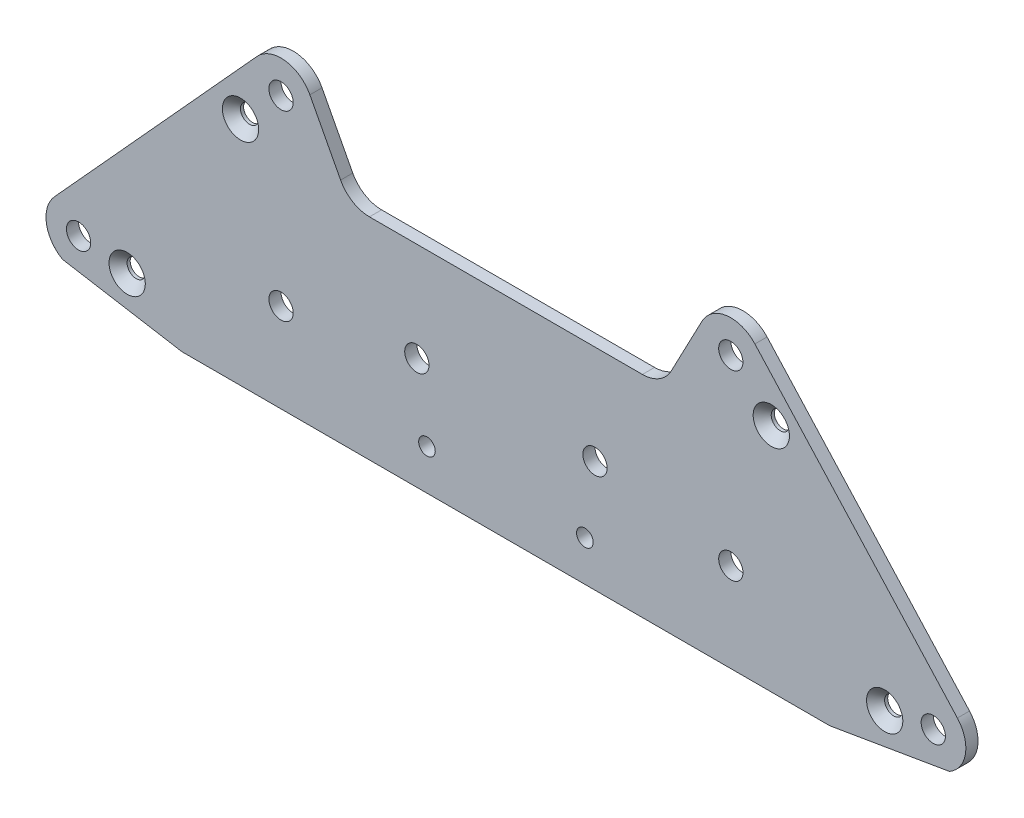
ISO-10303-21;
HEADER;
FILE_DESCRIPTION(('STEP AP214'),'2;1');
FILE_NAME('part.step','',(''),(''),'','','');
FILE_SCHEMA(('AUTOMOTIVE_DESIGN { 1 0 10303 214 1 1 1 1 }'));
ENDSEC;
DATA;
#1=APPLICATION_CONTEXT('core data for automotive mechanical design processes');
#2=APPLICATION_PROTOCOL_DEFINITION('international standard','automotive_design',2000,#1);
#3=PRODUCT_CONTEXT('',#1,'mechanical');
#4=PRODUCT('Part','Part','',(#3));
#5=PRODUCT_RELATED_PRODUCT_CATEGORY('part','',(#4));
#6=PRODUCT_DEFINITION_FORMATION('','',#4);
#7=PRODUCT_DEFINITION_CONTEXT('part definition',#1,'design');
#8=PRODUCT_DEFINITION('design','',#6,#7);
#9=PRODUCT_DEFINITION_SHAPE('','',#8);
#10=(LENGTH_UNIT() NAMED_UNIT(*) SI_UNIT(.MILLI.,.METRE.));
#11=(NAMED_UNIT(*) PLANE_ANGLE_UNIT() SI_UNIT($,.RADIAN.));
#12=(NAMED_UNIT(*) SI_UNIT($,.STERADIAN.) SOLID_ANGLE_UNIT());
#13=UNCERTAINTY_MEASURE_WITH_UNIT(LENGTH_MEASURE(1.E-05),#10,'distance_accuracy_value','');
#14=(GEOMETRIC_REPRESENTATION_CONTEXT(3) GLOBAL_UNCERTAINTY_ASSIGNED_CONTEXT((#13)) GLOBAL_UNIT_ASSIGNED_CONTEXT((#10,
#11,#12)) REPRESENTATION_CONTEXT('',''));
#15=CARTESIAN_POINT('',(0.,0.,0.));
#16=DIRECTION('',(0.,0.,1.));
#17=DIRECTION('',(1.,0.,0.));
#18=AXIS2_PLACEMENT_3D('',#15,#16,#17);
#19=CARTESIAN_POINT('',(105.536479783985,0.,3.));
#20=DIRECTION('',(0.,0.,-1.));
#21=DIRECTION('',(-1.,0.,0.));
#22=AXIS2_PLACEMENT_3D('',#19,#20,#21);
#23=PLANE('',#22);
#24=CARTESIAN_POINT('',(93.5364797839854,-2.00000000000001,3.));
#25=DIRECTION('',(0.,0.,1.));
#26=DIRECTION('',(1.,0.,0.));
#27=AXIS2_PLACEMENT_3D('',#24,#25,#26);
#28=CIRCLE('',#27,4.48);
#29=CARTESIAN_POINT('',(98.0164797839853,-2.00000000000001,3.));
#30=VERTEX_POINT('',#29);
#31=EDGE_CURVE('E418',#30,#30,#28,.T.);
#32=ORIENTED_EDGE('',*,*,#31,.F.);
#33=EDGE_LOOP('',(#32));
#34=FACE_BOUND('',#33,.T.);
#35=CARTESIAN_POINT('',(65.5364797839853,45.,3.));
#36=DIRECTION('',(0.,0.,1.));
#37=DIRECTION('',(1.,0.,0.));
#38=AXIS2_PLACEMENT_3D('',#35,#36,#37);
#39=CIRCLE('',#38,4.48);
#40=CARTESIAN_POINT('',(70.0164797839853,45.,3.));
#41=VERTEX_POINT('',#40);
#42=EDGE_CURVE('E428',#41,#41,#39,.T.);
#43=ORIENTED_EDGE('',*,*,#42,.F.);
#44=EDGE_LOOP('',(#43));
#45=FACE_BOUND('',#44,.T.);
#46=CARTESIAN_POINT('',(-65.5364797839853,45.,3.));
#47=DIRECTION('',(0.,0.,1.));
#48=DIRECTION('',(1.,0.,0.));
#49=AXIS2_PLACEMENT_3D('',#46,#47,#48);
#50=CIRCLE('',#49,4.48);
#51=CARTESIAN_POINT('',(-61.0564797839853,45.,3.));
#52=VERTEX_POINT('',#51);
#53=EDGE_CURVE('E440',#52,#52,#50,.T.);
#54=ORIENTED_EDGE('',*,*,#53,.F.);
#55=EDGE_LOOP('',(#54));
#56=FACE_BOUND('',#55,.T.);
#57=CARTESIAN_POINT('',(-93.5364797839853,-2.,3.));
#58=DIRECTION('',(0.,0.,1.));
#59=DIRECTION('',(1.,0.,0.));
#60=AXIS2_PLACEMENT_3D('',#57,#58,#59);
#61=CIRCLE('',#60,4.48);
#62=CARTESIAN_POINT('',(-89.0564797839853,-2.,3.));
#63=VERTEX_POINT('',#62);
#64=EDGE_CURVE('E452',#63,#63,#61,.T.);
#65=ORIENTED_EDGE('',*,*,#64,.F.);
#66=EDGE_LOOP('',(#65));
#67=FACE_BOUND('',#66,.T.);
#68=CARTESIAN_POINT('',(19.5,-2.,3.));
#69=DIRECTION('',(0.,0.,1.));
#70=DIRECTION('',(1.,0.,0.));
#71=AXIS2_PLACEMENT_3D('',#68,#69,#70);
#72=CIRCLE('',#71,2.04999999999999);
#73=CARTESIAN_POINT('',(21.55,-2.,3.));
#74=VERTEX_POINT('',#73);
#75=EDGE_CURVE('E464',#74,#74,#72,.T.);
#76=ORIENTED_EDGE('',*,*,#75,.F.);
#77=EDGE_LOOP('',(#76));
#78=FACE_BOUND('',#77,.T.);
#79=CARTESIAN_POINT('',(-19.5,-2.,3.));
#80=DIRECTION('',(0.,0.,1.));
#81=DIRECTION('',(1.,0.,0.));
#82=AXIS2_PLACEMENT_3D('',#79,#80,#81);
#83=CIRCLE('',#82,2.04999999999999);
#84=CARTESIAN_POINT('',(-17.45,-2.,3.));
#85=VERTEX_POINT('',#84);
#86=EDGE_CURVE('E469',#85,#85,#83,.T.);
#87=ORIENTED_EDGE('',*,*,#86,.F.);
#88=EDGE_LOOP('',(#87));
#89=FACE_BOUND('',#88,.T.);
#90=CARTESIAN_POINT('',(-21.9984081380424,15.5854946308941,3.));
#91=DIRECTION('',(0.,0.,1.));
#92=DIRECTION('',(1.,0.,0.));
#93=AXIS2_PLACEMENT_3D('',#90,#91,#92);
#94=CIRCLE('',#93,2.99999999999999);
#95=CARTESIAN_POINT('',(-18.9984081380424,15.5854946308941,3.));
#96=VERTEX_POINT('',#95);
#97=EDGE_CURVE('E489',#96,#96,#94,.T.);
#98=ORIENTED_EDGE('',*,*,#97,.F.);
#99=EDGE_LOOP('',(#98));
#100=FACE_BOUND('',#99,.T.);
#101=CARTESIAN_POINT('',(-55.5364797839854,10.,3.));
#102=DIRECTION('',(0.,0.,1.));
#103=DIRECTION('',(1.,0.,0.));
#104=AXIS2_PLACEMENT_3D('',#101,#102,#103);
#105=CIRCLE('',#104,2.99999999999999);
#106=CARTESIAN_POINT('',(-52.5364797839854,10.,3.));
#107=VERTEX_POINT('',#106);
#108=EDGE_CURVE('E505',#107,#107,#105,.T.);
#109=ORIENTED_EDGE('',*,*,#108,.F.);
#110=EDGE_LOOP('',(#109));
#111=FACE_BOUND('',#110,.T.);
#112=CARTESIAN_POINT('',(55.5364797839853,55.,3.));
#113=DIRECTION('',(0.,0.,1.));
#114=DIRECTION('',(1.,0.,0.));
#115=AXIS2_PLACEMENT_3D('',#112,#113,#114);
#116=CIRCLE('',#115,3.);
#117=CARTESIAN_POINT('',(58.5364797839853,55.,3.));
#118=VERTEX_POINT('',#117);
#119=EDGE_CURVE('E521',#118,#118,#116,.T.);
#120=ORIENTED_EDGE('',*,*,#119,.F.);
#121=EDGE_LOOP('',(#120));
#122=FACE_BOUND('',#121,.T.);
#123=CARTESIAN_POINT('',(105.536479783985,0.,3.));
#124=DIRECTION('',(0.,0.,1.));
#125=DIRECTION('',(1.,0.,0.));
#126=AXIS2_PLACEMENT_3D('',#123,#124,#125);
#127=CIRCLE('',#126,3.00000000000001);
#128=CARTESIAN_POINT('',(108.536479783985,0.,3.));
#129=VERTEX_POINT('',#128);
#130=EDGE_CURVE('E188',#129,#129,#127,.T.);
#131=ORIENTED_EDGE('',*,*,#130,.F.);
#132=EDGE_LOOP('',(#131));
#133=FACE_BOUND('',#132,.T.);
#134=DIRECTION('',(0.985942111915208,0.16708725849741,0.));
#135=VECTOR('',#134,1.);
#136=CARTESIAN_POINT('',(80.,-12.,3.));
#137=LINE('',#136,#135);
#138=CARTESIAN_POINT('',(80.,-12.,3.));
#139=VERTEX_POINT('',#138);
#140=CARTESIAN_POINT('',(109.503808991231,-6.99999999999999,3.));
#141=VERTEX_POINT('',#140);
#142=EDGE_CURVE('E224',#139,#141,#137,.T.);
#143=ORIENTED_EDGE('',*,*,#142,.T.);
#144=CARTESIAN_POINT('',(105.536479783985,0.,3.));
#145=DIRECTION('',(0.,0.,1.));
#146=DIRECTION('',(-1.,0.,0.));
#147=AXIS2_PLACEMENT_3D('',#144,#145,#146);
#148=CIRCLE('',#147,8.04609849794704);
#149=CARTESIAN_POINT('',(111.490110497107,5.41239155738356,3.));
#150=VERTEX_POINT('',#149);
#151=EDGE_CURVE('E124',#141,#150,#148,.T.);
#152=ORIENTED_EDGE('',*,*,#151,.T.);
#153=DIRECTION('',(-0.672672793996313,0.739940073395944,0.));
#154=VECTOR('',#153,1.);
#155=CARTESIAN_POINT('',(61.4901104971073,60.4123915573836,3.));
#156=LINE('',#155,#154);
#157=CARTESIAN_POINT('',(61.4901104971073,60.4123915573836,3.));
#158=VERTEX_POINT('',#157);
#159=EDGE_CURVE('E269',#150,#158,#156,.T.);
#160=ORIENTED_EDGE('',*,*,#159,.T.);
#161=CARTESIAN_POINT('',(55.5364797839853,55.,3.));
#162=DIRECTION('',(0.,0.,1.));
#163=DIRECTION('',(-1.,0.,0.));
#164=AXIS2_PLACEMENT_3D('',#161,#162,#163);
#165=CIRCLE('',#164,8.04609849794704);
#166=CARTESIAN_POINT('',(48.414233746898,58.743435911814,3.));
#167=VERTEX_POINT('',#166);
#168=EDGE_CURVE('E289',#158,#167,#165,.T.);
#169=ORIENTED_EDGE('',*,*,#168,.T.);
#170=DIRECTION('',(-0.465248581380051,-0.885180070677063,0.));
#171=VECTOR('',#170,1.);
#172=CARTESIAN_POINT('',(40.8241969551014,44.302662586133,3.));
#173=LINE('',#172,#171);
#174=CARTESIAN_POINT('',(40.8241969551014,44.302662586133,3.));
#175=VERTEX_POINT('',#174);
#176=EDGE_CURVE('E285',#167,#175,#173,.T.);
#177=ORIENTED_EDGE('',*,*,#176,.T.);
#178=CARTESIAN_POINT('',(33.701950918014,48.046098497947,3.));
#179=DIRECTION('',(0.,0.,-1.));
#180=DIRECTION('',(1.,0.,0.));
#181=AXIS2_PLACEMENT_3D('',#178,#179,#180);
#182=CIRCLE('',#181,8.04609849794704);
#183=CARTESIAN_POINT('',(33.701950918014,40.,3.));
#184=VERTEX_POINT('',#183);
#185=EDGE_CURVE('E288',#175,#184,#182,.T.);
#186=ORIENTED_EDGE('',*,*,#185,.T.);
#187=DIRECTION('',(-1.,0.,0.));
#188=VECTOR('',#187,1.);
#189=CARTESIAN_POINT('',(-33.7019509180141,40.,3.));
#190=LINE('',#189,#188);
#191=CARTESIAN_POINT('',(-33.7019509180141,40.,3.));
#192=VERTEX_POINT('',#191);
#193=EDGE_CURVE('E293',#184,#192,#190,.T.);
#194=ORIENTED_EDGE('',*,*,#193,.T.);
#195=CARTESIAN_POINT('',(-33.7019509180141,48.046098497947,3.));
#196=DIRECTION('',(0.,0.,-1.));
#197=DIRECTION('',(1.,0.,0.));
#198=AXIS2_PLACEMENT_3D('',#195,#196,#197);
#199=CIRCLE('',#198,8.04609849794705);
#200=CARTESIAN_POINT('',(-40.8241969551014,44.302662586133,3.));
#201=VERTEX_POINT('',#200);
#202=EDGE_CURVE('E300',#192,#201,#199,.T.);
#203=ORIENTED_EDGE('',*,*,#202,.T.);
#204=DIRECTION('',(-0.465248581380051,0.885180070677063,0.));
#205=VECTOR('',#204,1.);
#206=CARTESIAN_POINT('',(-48.414233746898,58.743435911814,3.));
#207=LINE('',#206,#205);
#208=CARTESIAN_POINT('',(-48.414233746898,58.743435911814,3.));
#209=VERTEX_POINT('',#208);
#210=EDGE_CURVE('E303',#201,#209,#207,.T.);
#211=ORIENTED_EDGE('',*,*,#210,.T.);
#212=CARTESIAN_POINT('',(-55.5364797839854,55.,3.));
#213=DIRECTION('',(0.,0.,1.));
#214=DIRECTION('',(-1.,0.,0.));
#215=AXIS2_PLACEMENT_3D('',#212,#213,#214);
#216=CIRCLE('',#215,8.04609849794704);
#217=CARTESIAN_POINT('',(-61.4901104971073,60.4123915573836,3.));
#218=VERTEX_POINT('',#217);
#219=EDGE_CURVE('E306',#209,#218,#216,.T.);
#220=ORIENTED_EDGE('',*,*,#219,.T.);
#221=DIRECTION('',(-0.672672793996313,-0.739940073395944,0.));
#222=VECTOR('',#221,1.);
#223=CARTESIAN_POINT('',(-111.490110497107,5.41239155738357,3.));
#224=LINE('',#223,#222);
#225=CARTESIAN_POINT('',(-111.490110497107,5.41239155738357,3.));
#226=VERTEX_POINT('',#225);
#227=EDGE_CURVE('E161',#218,#226,#224,.T.);
#228=ORIENTED_EDGE('',*,*,#227,.T.);
#229=CARTESIAN_POINT('',(-105.536479783985,0.,3.));
#230=DIRECTION('',(0.,0.,1.));
#231=DIRECTION('',(-1.,0.,0.));
#232=AXIS2_PLACEMENT_3D('',#229,#230,#231);
#233=CIRCLE('',#232,8.04609849794704);
#234=CARTESIAN_POINT('',(-109.503808991231,-7.,3.));
#235=VERTEX_POINT('',#234);
#236=EDGE_CURVE('E155',#226,#235,#233,.T.);
#237=ORIENTED_EDGE('',*,*,#236,.T.);
#238=DIRECTION('',(0.985942111915208,-0.16708725849741,0.));
#239=VECTOR('',#238,1.);
#240=CARTESIAN_POINT('',(-80.,-12.,3.));
#241=LINE('',#240,#239);
#242=CARTESIAN_POINT('',(-80.,-12.,3.));
#243=VERTEX_POINT('',#242);
#244=EDGE_CURVE('E159',#235,#243,#241,.T.);
#245=ORIENTED_EDGE('',*,*,#244,.T.);
#246=DIRECTION('',(1.,0.,0.));
#247=VECTOR('',#246,1.);
#248=CARTESIAN_POINT('',(-80.,-12.,3.));
#249=LINE('',#248,#247);
#250=EDGE_CURVE('E63',#243,#139,#249,.T.);
#251=ORIENTED_EDGE('',*,*,#250,.T.);
#252=EDGE_LOOP('',(#143,#152,#160,#169,#177,#186,#194,#203,#211,#220,#228,#237,#245,#251));
#253=FACE_BOUND('',#252,.T.);
#254=CARTESIAN_POINT('',(55.5364797839853,10.,3.));
#255=DIRECTION('',(0.,0.,1.));
#256=DIRECTION('',(1.,0.,0.));
#257=AXIS2_PLACEMENT_3D('',#254,#255,#256);
#258=CIRCLE('',#257,3.);
#259=CARTESIAN_POINT('',(58.5364797839853,10.,3.));
#260=VERTEX_POINT('',#259);
#261=EDGE_CURVE('E529',#260,#260,#258,.T.);
#262=ORIENTED_EDGE('',*,*,#261,.F.);
#263=EDGE_LOOP('',(#262));
#264=FACE_BOUND('',#263,.T.);
#265=CARTESIAN_POINT('',(-105.536479783985,0.,3.));
#266=DIRECTION('',(0.,0.,1.));
#267=DIRECTION('',(1.,0.,0.));
#268=AXIS2_PLACEMENT_3D('',#265,#266,#267);
#269=CIRCLE('',#268,2.99999999999999);
#270=CARTESIAN_POINT('',(-102.536479783985,0.,3.));
#271=VERTEX_POINT('',#270);
#272=EDGE_CURVE('E513',#271,#271,#269,.T.);
#273=ORIENTED_EDGE('',*,*,#272,.F.);
#274=EDGE_LOOP('',(#273));
#275=FACE_BOUND('',#274,.T.);
#276=CARTESIAN_POINT('',(-55.5364797839854,55.,3.));
#277=DIRECTION('',(0.,0.,1.));
#278=DIRECTION('',(1.,0.,0.));
#279=AXIS2_PLACEMENT_3D('',#276,#277,#278);
#280=CIRCLE('',#279,2.99999999999999);
#281=CARTESIAN_POINT('',(-52.5364797839854,55.,3.));
#282=VERTEX_POINT('',#281);
#283=EDGE_CURVE('E497',#282,#282,#280,.T.);
#284=ORIENTED_EDGE('',*,*,#283,.F.);
#285=EDGE_LOOP('',(#284));
#286=FACE_BOUND('',#285,.T.);
#287=CARTESIAN_POINT('',(21.9984081380424,15.5854946308941,3.));
#288=DIRECTION('',(0.,0.,1.));
#289=DIRECTION('',(1.,0.,0.));
#290=AXIS2_PLACEMENT_3D('',#287,#288,#289);
#291=CIRCLE('',#290,3.);
#292=CARTESIAN_POINT('',(24.9984081380424,15.5854946308941,3.));
#293=VERTEX_POINT('',#292);
#294=EDGE_CURVE('E481',#293,#293,#291,.T.);
#295=ORIENTED_EDGE('',*,*,#294,.F.);
#296=EDGE_LOOP('',(#295));
#297=FACE_BOUND('',#296,.T.);
#298=ADVANCED_FACE('F45',(#34,#45,#56,#67,#78,#89,#100,#111,#122,#133,#253,#264,#275,#286,#297),
#23,.F.);
#299=CARTESIAN_POINT('',(105.536479783985,0.,0.));
#300=DIRECTION('',(0.,0.,-1.));
#301=DIRECTION('',(-1.,0.,0.));
#302=AXIS2_PLACEMENT_3D('',#299,#300,#301);
#303=PLANE('',#302);
#304=CARTESIAN_POINT('',(93.5364797839854,-2.00000000000001,0.));
#305=DIRECTION('',(0.,0.,1.));
#306=DIRECTION('',(1.,0.,0.));
#307=AXIS2_PLACEMENT_3D('',#304,#305,#306);
#308=CIRCLE('',#307,2.25);
#309=CARTESIAN_POINT('',(95.7864797839854,-2.00000000000001,0.));
#310=VERTEX_POINT('',#309);
#311=EDGE_CURVE('E422',#310,#310,#308,.T.);
#312=ORIENTED_EDGE('',*,*,#311,.T.);
#313=EDGE_LOOP('',(#312));
#314=FACE_BOUND('',#313,.T.);
#315=CARTESIAN_POINT('',(65.5364797839853,45.,0.));
#316=DIRECTION('',(0.,0.,1.));
#317=DIRECTION('',(1.,0.,0.));
#318=AXIS2_PLACEMENT_3D('',#315,#316,#317);
#319=CIRCLE('',#318,2.25);
#320=CARTESIAN_POINT('',(67.7864797839853,45.,0.));
#321=VERTEX_POINT('',#320);
#322=EDGE_CURVE('E436',#321,#321,#319,.T.);
#323=ORIENTED_EDGE('',*,*,#322,.T.);
#324=EDGE_LOOP('',(#323));
#325=FACE_BOUND('',#324,.T.);
#326=CARTESIAN_POINT('',(-65.5364797839853,45.,0.));
#327=DIRECTION('',(0.,0.,1.));
#328=DIRECTION('',(1.,0.,0.));
#329=AXIS2_PLACEMENT_3D('',#326,#327,#328);
#330=CIRCLE('',#329,2.25);
#331=CARTESIAN_POINT('',(-63.2864797839853,45.,0.));
#332=VERTEX_POINT('',#331);
#333=EDGE_CURVE('E448',#332,#332,#330,.T.);
#334=ORIENTED_EDGE('',*,*,#333,.T.);
#335=EDGE_LOOP('',(#334));
#336=FACE_BOUND('',#335,.T.);
#337=CARTESIAN_POINT('',(-93.5364797839853,-2.,0.));
#338=DIRECTION('',(0.,0.,1.));
#339=DIRECTION('',(1.,0.,0.));
#340=AXIS2_PLACEMENT_3D('',#337,#338,#339);
#341=CIRCLE('',#340,2.25);
#342=CARTESIAN_POINT('',(-91.2864797839853,-2.,0.));
#343=VERTEX_POINT('',#342);
#344=EDGE_CURVE('E460',#343,#343,#341,.T.);
#345=ORIENTED_EDGE('',*,*,#344,.T.);
#346=EDGE_LOOP('',(#345));
#347=FACE_BOUND('',#346,.T.);
#348=CARTESIAN_POINT('',(19.5,-2.,0.));
#349=DIRECTION('',(0.,0.,1.));
#350=DIRECTION('',(1.,0.,0.));
#351=AXIS2_PLACEMENT_3D('',#348,#349,#350);
#352=CIRCLE('',#351,2.04999999999999);
#353=CARTESIAN_POINT('',(21.55,-2.,0.));
#354=VERTEX_POINT('',#353);
#355=EDGE_CURVE('E465',#354,#354,#352,.T.);
#356=ORIENTED_EDGE('',*,*,#355,.T.);
#357=EDGE_LOOP('',(#356));
#358=FACE_BOUND('',#357,.T.);
#359=CARTESIAN_POINT('',(-19.5,-2.,0.));
#360=DIRECTION('',(0.,0.,1.));
#361=DIRECTION('',(1.,0.,0.));
#362=AXIS2_PLACEMENT_3D('',#359,#360,#361);
#363=CIRCLE('',#362,2.04999999999999);
#364=CARTESIAN_POINT('',(-17.45,-2.,0.));
#365=VERTEX_POINT('',#364);
#366=EDGE_CURVE('E473',#365,#365,#363,.T.);
#367=ORIENTED_EDGE('',*,*,#366,.T.);
#368=EDGE_LOOP('',(#367));
#369=FACE_BOUND('',#368,.T.);
#370=CARTESIAN_POINT('',(-21.9984081380424,15.5854946308941,0.));
#371=DIRECTION('',(0.,0.,1.));
#372=DIRECTION('',(1.,0.,0.));
#373=AXIS2_PLACEMENT_3D('',#370,#371,#372);
#374=CIRCLE('',#373,2.99999999999999);
#375=CARTESIAN_POINT('',(-18.9984081380424,15.5854946308941,0.));
#376=VERTEX_POINT('',#375);
#377=EDGE_CURVE('E485',#376,#376,#374,.T.);
#378=ORIENTED_EDGE('',*,*,#377,.T.);
#379=EDGE_LOOP('',(#378));
#380=FACE_BOUND('',#379,.T.);
#381=CARTESIAN_POINT('',(-55.5364797839854,10.,0.));
#382=DIRECTION('',(0.,0.,1.));
#383=DIRECTION('',(1.,0.,0.));
#384=AXIS2_PLACEMENT_3D('',#381,#382,#383);
#385=CIRCLE('',#384,2.99999999999999);
#386=CARTESIAN_POINT('',(-52.5364797839854,10.,0.));
#387=VERTEX_POINT('',#386);
#388=EDGE_CURVE('E501',#387,#387,#385,.T.);
#389=ORIENTED_EDGE('',*,*,#388,.T.);
#390=EDGE_LOOP('',(#389));
#391=FACE_BOUND('',#390,.T.);
#392=CARTESIAN_POINT('',(55.5364797839853,55.,0.));
#393=DIRECTION('',(0.,0.,1.));
#394=DIRECTION('',(1.,0.,0.));
#395=AXIS2_PLACEMENT_3D('',#392,#393,#394);
#396=CIRCLE('',#395,3.);
#397=CARTESIAN_POINT('',(58.5364797839853,55.,0.));
#398=VERTEX_POINT('',#397);
#399=EDGE_CURVE('E517',#398,#398,#396,.T.);
#400=ORIENTED_EDGE('',*,*,#399,.T.);
#401=EDGE_LOOP('',(#400));
#402=FACE_BOUND('',#401,.T.);
#403=CARTESIAN_POINT('',(105.536479783985,0.,0.));
#404=DIRECTION('',(0.,0.,1.));
#405=DIRECTION('',(1.,0.,0.));
#406=AXIS2_PLACEMENT_3D('',#403,#404,#405);
#407=CIRCLE('',#406,3.00000000000001);
#408=CARTESIAN_POINT('',(108.536479783985,0.,0.));
#409=VERTEX_POINT('',#408);
#410=EDGE_CURVE('E533',#409,#409,#407,.T.);
#411=ORIENTED_EDGE('',*,*,#410,.T.);
#412=EDGE_LOOP('',(#411));
#413=FACE_BOUND('',#412,.T.);
#414=DIRECTION('',(0.985942111915208,0.16708725849741,0.));
#415=VECTOR('',#414,1.);
#416=CARTESIAN_POINT('',(80.,-12.,0.));
#417=LINE('',#416,#415);
#418=CARTESIAN_POINT('',(80.,-12.,0.));
#419=VERTEX_POINT('',#418);
#420=CARTESIAN_POINT('',(109.503808991231,-6.99999999999999,0.));
#421=VERTEX_POINT('',#420);
#422=EDGE_CURVE('E183',#419,#421,#417,.T.);
#423=ORIENTED_EDGE('',*,*,#422,.F.);
#424=DIRECTION('',(1.,0.,0.));
#425=VECTOR('',#424,1.);
#426=CARTESIAN_POINT('',(-80.,-12.,0.));
#427=LINE('',#426,#425);
#428=CARTESIAN_POINT('',(-80.,-12.,0.));
#429=VERTEX_POINT('',#428);
#430=EDGE_CURVE('E116',#429,#419,#427,.T.);
#431=ORIENTED_EDGE('',*,*,#430,.F.);
#432=DIRECTION('',(0.985942111915208,-0.16708725849741,0.));
#433=VECTOR('',#432,1.);
#434=CARTESIAN_POINT('',(-80.,-12.,0.));
#435=LINE('',#434,#433);
#436=CARTESIAN_POINT('',(-109.503808991231,-7.,0.));
#437=VERTEX_POINT('',#436);
#438=EDGE_CURVE('E110',#437,#429,#435,.T.);
#439=ORIENTED_EDGE('',*,*,#438,.F.);
#440=CARTESIAN_POINT('',(-105.536479783985,0.,0.));
#441=DIRECTION('',(0.,0.,1.));
#442=DIRECTION('',(-1.,0.,0.));
#443=AXIS2_PLACEMENT_3D('',#440,#441,#442);
#444=CIRCLE('',#443,8.04609849794704);
#445=CARTESIAN_POINT('',(-111.490110497107,5.41239155738357,0.));
#446=VERTEX_POINT('',#445);
#447=EDGE_CURVE('E170',#446,#437,#444,.T.);
#448=ORIENTED_EDGE('',*,*,#447,.F.);
#449=DIRECTION('',(-0.672672793996313,-0.739940073395944,0.));
#450=VECTOR('',#449,1.);
#451=CARTESIAN_POINT('',(-111.490110497107,5.41239155738357,0.));
#452=LINE('',#451,#450);
#453=CARTESIAN_POINT('',(-61.4901104971073,60.4123915573836,0.));
#454=VERTEX_POINT('',#453);
#455=EDGE_CURVE('E215',#454,#446,#452,.T.);
#456=ORIENTED_EDGE('',*,*,#455,.F.);
#457=CARTESIAN_POINT('',(-55.5364797839854,55.,0.));
#458=DIRECTION('',(0.,0.,1.));
#459=DIRECTION('',(-1.,0.,0.));
#460=AXIS2_PLACEMENT_3D('',#457,#458,#459);
#461=CIRCLE('',#460,8.04609849794704);
#462=CARTESIAN_POINT('',(-48.414233746898,58.743435911814,0.));
#463=VERTEX_POINT('',#462);
#464=EDGE_CURVE('E212',#463,#454,#461,.T.);
#465=ORIENTED_EDGE('',*,*,#464,.F.);
#466=DIRECTION('',(-0.465248581380051,0.885180070677063,0.));
#467=VECTOR('',#466,1.);
#468=CARTESIAN_POINT('',(-48.414233746898,58.743435911814,0.));
#469=LINE('',#468,#467);
#470=CARTESIAN_POINT('',(-40.8241969551014,44.302662586133,0.));
#471=VERTEX_POINT('',#470);
#472=EDGE_CURVE('E209',#471,#463,#469,.T.);
#473=ORIENTED_EDGE('',*,*,#472,.F.);
#474=CARTESIAN_POINT('',(-33.7019509180141,48.046098497947,0.));
#475=DIRECTION('',(0.,0.,-1.));
#476=DIRECTION('',(1.,0.,0.));
#477=AXIS2_PLACEMENT_3D('',#474,#475,#476);
#478=CIRCLE('',#477,8.04609849794705);
#479=CARTESIAN_POINT('',(-33.7019509180141,40.,0.));
#480=VERTEX_POINT('',#479);
#481=EDGE_CURVE('E206',#480,#471,#478,.T.);
#482=ORIENTED_EDGE('',*,*,#481,.F.);
#483=DIRECTION('',(-1.,0.,0.));
#484=VECTOR('',#483,1.);
#485=CARTESIAN_POINT('',(-33.7019509180141,40.,0.));
#486=LINE('',#485,#484);
#487=CARTESIAN_POINT('',(33.701950918014,40.,0.));
#488=VERTEX_POINT('',#487);
#489=EDGE_CURVE('E203',#488,#480,#486,.T.);
#490=ORIENTED_EDGE('',*,*,#489,.F.);
#491=CARTESIAN_POINT('',(33.701950918014,48.046098497947,0.));
#492=DIRECTION('',(0.,0.,-1.));
#493=DIRECTION('',(1.,0.,0.));
#494=AXIS2_PLACEMENT_3D('',#491,#492,#493);
#495=CIRCLE('',#494,8.04609849794704);
#496=CARTESIAN_POINT('',(40.8241969551014,44.302662586133,0.));
#497=VERTEX_POINT('',#496);
#498=EDGE_CURVE('E200',#497,#488,#495,.T.);
#499=ORIENTED_EDGE('',*,*,#498,.F.);
#500=DIRECTION('',(-0.465248581380051,-0.885180070677063,0.));
#501=VECTOR('',#500,1.);
#502=CARTESIAN_POINT('',(40.8241969551014,44.302662586133,0.));
#503=LINE('',#502,#501);
#504=CARTESIAN_POINT('',(48.414233746898,58.743435911814,0.));
#505=VERTEX_POINT('',#504);
#506=EDGE_CURVE('E197',#505,#497,#503,.T.);
#507=ORIENTED_EDGE('',*,*,#506,.F.);
#508=CARTESIAN_POINT('',(55.5364797839853,55.,0.));
#509=DIRECTION('',(0.,0.,1.));
#510=DIRECTION('',(-1.,0.,0.));
#511=AXIS2_PLACEMENT_3D('',#508,#509,#510);
#512=CIRCLE('',#511,8.04609849794704);
#513=CARTESIAN_POINT('',(61.4901104971073,60.4123915573836,0.));
#514=VERTEX_POINT('',#513);
#515=EDGE_CURVE('E194',#514,#505,#512,.T.);
#516=ORIENTED_EDGE('',*,*,#515,.F.);
#517=DIRECTION('',(-0.672672793996313,0.739940073395944,0.));
#518=VECTOR('',#517,1.);
#519=CARTESIAN_POINT('',(61.4901104971073,60.4123915573836,0.));
#520=LINE('',#519,#518);
#521=CARTESIAN_POINT('',(111.490110497107,5.41239155738356,0.));
#522=VERTEX_POINT('',#521);
#523=EDGE_CURVE('E191',#522,#514,#520,.T.);
#524=ORIENTED_EDGE('',*,*,#523,.F.);
#525=CARTESIAN_POINT('',(105.536479783985,0.,0.));
#526=DIRECTION('',(0.,0.,1.));
#527=DIRECTION('',(-1.,0.,0.));
#528=AXIS2_PLACEMENT_3D('',#525,#526,#527);
#529=CIRCLE('',#528,8.04609849794704);
#530=EDGE_CURVE('E187',#421,#522,#529,.T.);
#531=ORIENTED_EDGE('',*,*,#530,.F.);
#532=EDGE_LOOP('',(#423,#431,#439,#448,#456,#465,#473,#482,#490,#499,#507,#516,#524,#531));
#533=FACE_BOUND('',#532,.T.);
#534=CARTESIAN_POINT('',(55.5364797839853,10.,0.));
#535=DIRECTION('',(0.,0.,1.));
#536=DIRECTION('',(1.,0.,0.));
#537=AXIS2_PLACEMENT_3D('',#534,#535,#536);
#538=CIRCLE('',#537,3.);
#539=CARTESIAN_POINT('',(58.5364797839853,10.,0.));
#540=VERTEX_POINT('',#539);
#541=EDGE_CURVE('E525',#540,#540,#538,.T.);
#542=ORIENTED_EDGE('',*,*,#541,.T.);
#543=EDGE_LOOP('',(#542));
#544=FACE_BOUND('',#543,.T.);
#545=CARTESIAN_POINT('',(-105.536479783985,0.,0.));
#546=DIRECTION('',(0.,0.,1.));
#547=DIRECTION('',(1.,0.,0.));
#548=AXIS2_PLACEMENT_3D('',#545,#546,#547);
#549=CIRCLE('',#548,2.99999999999999);
#550=CARTESIAN_POINT('',(-102.536479783985,0.,0.));
#551=VERTEX_POINT('',#550);
#552=EDGE_CURVE('E509',#551,#551,#549,.T.);
#553=ORIENTED_EDGE('',*,*,#552,.T.);
#554=EDGE_LOOP('',(#553));
#555=FACE_BOUND('',#554,.T.);
#556=CARTESIAN_POINT('',(-55.5364797839854,55.,0.));
#557=DIRECTION('',(0.,0.,1.));
#558=DIRECTION('',(1.,0.,0.));
#559=AXIS2_PLACEMENT_3D('',#556,#557,#558);
#560=CIRCLE('',#559,2.99999999999999);
#561=CARTESIAN_POINT('',(-52.5364797839854,55.,0.));
#562=VERTEX_POINT('',#561);
#563=EDGE_CURVE('E493',#562,#562,#560,.T.);
#564=ORIENTED_EDGE('',*,*,#563,.T.);
#565=EDGE_LOOP('',(#564));
#566=FACE_BOUND('',#565,.T.);
#567=CARTESIAN_POINT('',(21.9984081380424,15.5854946308941,0.));
#568=DIRECTION('',(0.,0.,1.));
#569=DIRECTION('',(1.,0.,0.));
#570=AXIS2_PLACEMENT_3D('',#567,#568,#569);
#571=CIRCLE('',#570,3.);
#572=CARTESIAN_POINT('',(24.9984081380424,15.5854946308941,0.));
#573=VERTEX_POINT('',#572);
#574=EDGE_CURVE('E477',#573,#573,#571,.T.);
#575=ORIENTED_EDGE('',*,*,#574,.T.);
#576=EDGE_LOOP('',(#575));
#577=FACE_BOUND('',#576,.T.);
#578=ADVANCED_FACE('F273',(#314,#325,#336,#347,#358,#369,#380,#391,#402,#413,#533,#544,#555,
#566,#577),#303,.T.);
#579=CARTESIAN_POINT('',(80.,-12.,3.));
#580=DIRECTION('',(-0.16708725849741,0.985942111915208,0.));
#581=DIRECTION('',(-0.985942111915208,-0.16708725849741,0.));
#582=AXIS2_PLACEMENT_3D('',#579,#580,#581);
#583=PLANE('',#582);
#584=ORIENTED_EDGE('',*,*,#422,.T.);
#585=DIRECTION('',(0.,0.,-1.));
#586=VECTOR('',#585,1.);
#587=CARTESIAN_POINT('',(109.503808991231,-6.99999999999999,3.));
#588=LINE('',#587,#586);
#589=EDGE_CURVE('E11',#141,#421,#588,.T.);
#590=ORIENTED_EDGE('',*,*,#589,.F.);
#591=ORIENTED_EDGE('',*,*,#142,.F.);
#592=DIRECTION('',(0.,0.,-1.));
#593=VECTOR('',#592,1.);
#594=CARTESIAN_POINT('',(80.,-12.,3.));
#595=LINE('',#594,#593);
#596=EDGE_CURVE('E179',#139,#419,#595,.T.);
#597=ORIENTED_EDGE('',*,*,#596,.T.);
#598=EDGE_LOOP('',(#584,#590,#591,#597));
#599=FACE_BOUND('',#598,.T.);
#600=ADVANCED_FACE('F47',(#599),#583,.F.);
#601=CARTESIAN_POINT('',(105.536479783985,0.,3.));
#602=DIRECTION('',(0.,0.,-1.));
#603=DIRECTION('',(-1.,0.,0.));
#604=AXIS2_PLACEMENT_3D('',#601,#602,#603);
#605=CYLINDRICAL_SURFACE('',#604,8.04609849794704);
#606=ORIENTED_EDGE('',*,*,#530,.T.);
#607=DIRECTION('',(0.,0.,-1.));
#608=VECTOR('',#607,1.);
#609=CARTESIAN_POINT('',(111.490110497107,5.41239155738356,3.));
#610=LINE('',#609,#608);
#611=EDGE_CURVE('E55',#150,#522,#610,.T.);
#612=ORIENTED_EDGE('',*,*,#611,.F.);
#613=ORIENTED_EDGE('',*,*,#151,.F.);
#614=ORIENTED_EDGE('',*,*,#589,.T.);
#615=EDGE_LOOP('',(#606,#612,#613,#614));
#616=FACE_BOUND('',#615,.T.);
#617=ADVANCED_FACE('F787',(#616),#605,.T.);
#618=CARTESIAN_POINT('',(61.4901104971073,60.4123915573836,3.));
#619=DIRECTION('',(-0.739940073395944,-0.672672793996313,0.));
#620=DIRECTION('',(0.672672793996313,-0.739940073395944,0.));
#621=AXIS2_PLACEMENT_3D('',#618,#619,#620);
#622=PLANE('',#621);
#623=ORIENTED_EDGE('',*,*,#523,.T.);
#624=DIRECTION('',(0.,0.,-1.));
#625=VECTOR('',#624,1.);
#626=CARTESIAN_POINT('',(61.4901104971073,60.4123915573836,3.));
#627=LINE('',#626,#625);
#628=EDGE_CURVE('E259',#158,#514,#627,.T.);
#629=ORIENTED_EDGE('',*,*,#628,.F.);
#630=ORIENTED_EDGE('',*,*,#159,.F.);
#631=ORIENTED_EDGE('',*,*,#611,.T.);
#632=EDGE_LOOP('',(#623,#629,#630,#631));
#633=FACE_BOUND('',#632,.T.);
#634=ADVANCED_FACE('F267',(#633),#622,.F.);
#635=CARTESIAN_POINT('',(55.5364797839853,55.,3.));
#636=DIRECTION('',(0.,0.,-1.));
#637=DIRECTION('',(-1.,0.,0.));
#638=AXIS2_PLACEMENT_3D('',#635,#636,#637);
#639=CYLINDRICAL_SURFACE('',#638,8.04609849794704);
#640=ORIENTED_EDGE('',*,*,#515,.T.);
#641=DIRECTION('',(0.,0.,-1.));
#642=VECTOR('',#641,1.);
#643=CARTESIAN_POINT('',(48.414233746898,58.743435911814,3.));
#644=LINE('',#643,#642);
#645=EDGE_CURVE('E255',#167,#505,#644,.T.);
#646=ORIENTED_EDGE('',*,*,#645,.F.);
#647=ORIENTED_EDGE('',*,*,#168,.F.);
#648=ORIENTED_EDGE('',*,*,#628,.T.);
#649=EDGE_LOOP('',(#640,#646,#647,#648));
#650=FACE_BOUND('',#649,.T.);
#651=ADVANCED_FACE('F279',(#650),#639,.T.);
#652=CARTESIAN_POINT('',(40.8241969551014,44.302662586133,3.));
#653=DIRECTION('',(0.885180070677063,-0.465248581380051,0.));
#654=DIRECTION('',(0.465248581380051,0.885180070677063,0.));
#655=AXIS2_PLACEMENT_3D('',#652,#653,#654);
#656=PLANE('',#655);
#657=ORIENTED_EDGE('',*,*,#506,.T.);
#658=DIRECTION('',(0.,0.,-1.));
#659=VECTOR('',#658,1.);
#660=CARTESIAN_POINT('',(40.8241969551014,44.302662586133,3.));
#661=LINE('',#660,#659);
#662=EDGE_CURVE('E251',#175,#497,#661,.T.);
#663=ORIENTED_EDGE('',*,*,#662,.F.);
#664=ORIENTED_EDGE('',*,*,#176,.F.);
#665=ORIENTED_EDGE('',*,*,#645,.T.);
#666=EDGE_LOOP('',(#657,#663,#664,#665));
#667=FACE_BOUND('',#666,.T.);
#668=ADVANCED_FACE('F283',(#667),#656,.F.);
#669=CARTESIAN_POINT('',(33.701950918014,48.046098497947,3.));
#670=DIRECTION('',(0.,0.,-1.));
#671=DIRECTION('',(-1.,0.,0.));
#672=AXIS2_PLACEMENT_3D('',#669,#670,#671);
#673=CYLINDRICAL_SURFACE('',#672,8.04609849794704);
#674=ORIENTED_EDGE('',*,*,#498,.T.);
#675=DIRECTION('',(0.,0.,-1.));
#676=VECTOR('',#675,1.);
#677=CARTESIAN_POINT('',(33.701950918014,40.,3.));
#678=LINE('',#677,#676);
#679=EDGE_CURVE('E247',#184,#488,#678,.T.);
#680=ORIENTED_EDGE('',*,*,#679,.F.);
#681=ORIENTED_EDGE('',*,*,#185,.F.);
#682=ORIENTED_EDGE('',*,*,#662,.T.);
#683=EDGE_LOOP('',(#674,#680,#681,#682));
#684=FACE_BOUND('',#683,.T.);
#685=ADVANCED_FACE('F752',(#684),#673,.F.);
#686=CARTESIAN_POINT('',(-33.7019509180141,40.,3.));
#687=DIRECTION('',(0.,-1.,0.));
#688=DIRECTION('',(1.,0.,0.));
#689=AXIS2_PLACEMENT_3D('',#686,#687,#688);
#690=PLANE('',#689);
#691=ORIENTED_EDGE('',*,*,#489,.T.);
#692=DIRECTION('',(0.,0.,-1.));
#693=VECTOR('',#692,1.);
#694=CARTESIAN_POINT('',(-33.7019509180141,40.,3.));
#695=LINE('',#694,#693);
#696=EDGE_CURVE('E243',#192,#480,#695,.T.);
#697=ORIENTED_EDGE('',*,*,#696,.F.);
#698=ORIENTED_EDGE('',*,*,#193,.F.);
#699=ORIENTED_EDGE('',*,*,#679,.T.);
#700=EDGE_LOOP('',(#691,#697,#698,#699));
#701=FACE_BOUND('',#700,.T.);
#702=ADVANCED_FACE('F742',(#701),#690,.F.);
#703=CARTESIAN_POINT('',(-33.7019509180141,48.046098497947,3.));
#704=DIRECTION('',(0.,0.,-1.));
#705=DIRECTION('',(-1.,0.,0.));
#706=AXIS2_PLACEMENT_3D('',#703,#704,#705);
#707=CYLINDRICAL_SURFACE('',#706,8.04609849794705);
#708=ORIENTED_EDGE('',*,*,#481,.T.);
#709=DIRECTION('',(0.,0.,-1.));
#710=VECTOR('',#709,1.);
#711=CARTESIAN_POINT('',(-40.8241969551014,44.302662586133,3.));
#712=LINE('',#711,#710);
#713=EDGE_CURVE('E239',#201,#471,#712,.T.);
#714=ORIENTED_EDGE('',*,*,#713,.F.);
#715=ORIENTED_EDGE('',*,*,#202,.F.);
#716=ORIENTED_EDGE('',*,*,#696,.T.);
#717=EDGE_LOOP('',(#708,#714,#715,#716));
#718=FACE_BOUND('',#717,.T.);
#719=ADVANCED_FACE('F732',(#718),#707,.F.);
#720=CARTESIAN_POINT('',(-48.414233746898,58.743435911814,3.));
#721=DIRECTION('',(-0.885180070677063,-0.465248581380051,0.));
#722=DIRECTION('',(0.465248581380051,-0.885180070677063,0.));
#723=AXIS2_PLACEMENT_3D('',#720,#721,#722);
#724=PLANE('',#723);
#725=ORIENTED_EDGE('',*,*,#472,.T.);
#726=DIRECTION('',(0.,0.,-1.));
#727=VECTOR('',#726,1.);
#728=CARTESIAN_POINT('',(-48.414233746898,58.743435911814,3.));
#729=LINE('',#728,#727);
#730=EDGE_CURVE('E235',#209,#463,#729,.T.);
#731=ORIENTED_EDGE('',*,*,#730,.F.);
#732=ORIENTED_EDGE('',*,*,#210,.F.);
#733=ORIENTED_EDGE('',*,*,#713,.T.);
#734=EDGE_LOOP('',(#725,#731,#732,#733));
#735=FACE_BOUND('',#734,.T.);
#736=ADVANCED_FACE('F723',(#735),#724,.F.);
#737=CARTESIAN_POINT('',(-55.5364797839854,55.,3.));
#738=DIRECTION('',(0.,0.,-1.));
#739=DIRECTION('',(-1.,0.,0.));
#740=AXIS2_PLACEMENT_3D('',#737,#738,#739);
#741=CYLINDRICAL_SURFACE('',#740,8.04609849794704);
#742=ORIENTED_EDGE('',*,*,#464,.T.);
#743=DIRECTION('',(0.,0.,-1.));
#744=VECTOR('',#743,1.);
#745=CARTESIAN_POINT('',(-61.4901104971073,60.4123915573836,3.));
#746=LINE('',#745,#744);
#747=EDGE_CURVE('E231',#218,#454,#746,.T.);
#748=ORIENTED_EDGE('',*,*,#747,.F.);
#749=ORIENTED_EDGE('',*,*,#219,.F.);
#750=ORIENTED_EDGE('',*,*,#730,.T.);
#751=EDGE_LOOP('',(#742,#748,#749,#750));
#752=FACE_BOUND('',#751,.T.);
#753=ADVANCED_FACE('F314',(#752),#741,.T.);
#754=CARTESIAN_POINT('',(-111.490110497107,5.41239155738357,3.));
#755=DIRECTION('',(0.739940073395944,-0.672672793996313,0.));
#756=DIRECTION('',(0.672672793996313,0.739940073395944,0.));
#757=AXIS2_PLACEMENT_3D('',#754,#755,#756);
#758=PLANE('',#757);
#759=ORIENTED_EDGE('',*,*,#455,.T.);
#760=DIRECTION('',(0.,0.,-1.));
#761=VECTOR('',#760,1.);
#762=CARTESIAN_POINT('',(-111.490110497107,5.41239155738357,3.));
#763=LINE('',#762,#761);
#764=EDGE_CURVE('E172',#226,#446,#763,.T.);
#765=ORIENTED_EDGE('',*,*,#764,.F.);
#766=ORIENTED_EDGE('',*,*,#227,.F.);
#767=ORIENTED_EDGE('',*,*,#747,.T.);
#768=EDGE_LOOP('',(#759,#765,#766,#767));
#769=FACE_BOUND('',#768,.T.);
#770=ADVANCED_FACE('F318',(#769),#758,.F.);
#771=CARTESIAN_POINT('',(-105.536479783985,0.,3.));
#772=DIRECTION('',(0.,0.,-1.));
#773=DIRECTION('',(-1.,0.,0.));
#774=AXIS2_PLACEMENT_3D('',#771,#772,#773);
#775=CYLINDRICAL_SURFACE('',#774,8.04609849794704);
#776=ORIENTED_EDGE('',*,*,#447,.T.);
#777=DIRECTION('',(0.,0.,-1.));
#778=VECTOR('',#777,1.);
#779=CARTESIAN_POINT('',(-109.503808991231,-7.,3.));
#780=LINE('',#779,#778);
#781=EDGE_CURVE('E167',#235,#437,#780,.T.);
#782=ORIENTED_EDGE('',*,*,#781,.F.);
#783=ORIENTED_EDGE('',*,*,#236,.F.);
#784=ORIENTED_EDGE('',*,*,#764,.T.);
#785=EDGE_LOOP('',(#776,#782,#783,#784));
#786=FACE_BOUND('',#785,.T.);
#787=ADVANCED_FACE('F168',(#786),#775,.T.);
#788=CARTESIAN_POINT('',(-80.,-12.,3.));
#789=DIRECTION('',(0.16708725849741,0.985942111915208,0.));
#790=DIRECTION('',(-0.985942111915208,0.16708725849741,0.));
#791=AXIS2_PLACEMENT_3D('',#788,#789,#790);
#792=PLANE('',#791);
#793=ORIENTED_EDGE('',*,*,#438,.T.);
#794=DIRECTION('',(0.,0.,-1.));
#795=VECTOR('',#794,1.);
#796=CARTESIAN_POINT('',(-80.,-12.,3.));
#797=LINE('',#796,#795);
#798=EDGE_CURVE('E173',#243,#429,#797,.T.);
#799=ORIENTED_EDGE('',*,*,#798,.F.);
#800=ORIENTED_EDGE('',*,*,#244,.F.);
#801=ORIENTED_EDGE('',*,*,#781,.T.);
#802=EDGE_LOOP('',(#793,#799,#800,#801));
#803=FACE_BOUND('',#802,.T.);
#804=ADVANCED_FACE('F175',(#803),#792,.F.);
#805=CARTESIAN_POINT('',(-80.,-12.,3.));
#806=DIRECTION('',(0.,1.,0.));
#807=DIRECTION('',(0.,0.,1.));
#808=AXIS2_PLACEMENT_3D('',#805,#806,#807);
#809=PLANE('',#808);
#810=ORIENTED_EDGE('',*,*,#430,.T.);
#811=ORIENTED_EDGE('',*,*,#596,.F.);
#812=ORIENTED_EDGE('',*,*,#250,.F.);
#813=ORIENTED_EDGE('',*,*,#798,.T.);
#814=EDGE_LOOP('',(#810,#811,#812,#813));
#815=FACE_BOUND('',#814,.T.);
#816=ADVANCED_FACE('F322',(#815),#809,.F.);
#817=CARTESIAN_POINT('',(105.536479783985,0.,3.));
#818=DIRECTION('',(0.,0.,-1.));
#819=DIRECTION('',(-1.,0.,0.));
#820=AXIS2_PLACEMENT_3D('',#817,#818,#819);
#821=CYLINDRICAL_SURFACE('',#820,3.00000000000001);
#822=ORIENTED_EDGE('',*,*,#130,.T.);
#823=EDGE_LOOP('',(#822));
#824=FACE_BOUND('',#823,.T.);
#825=ORIENTED_EDGE('',*,*,#410,.F.);
#826=EDGE_LOOP('',(#825));
#827=FACE_BOUND('',#826,.T.);
#828=ADVANCED_FACE('F324',(#824,#827),#821,.F.);
#829=CARTESIAN_POINT('',(55.5364797839853,10.,3.));
#830=DIRECTION('',(0.,0.,-1.));
#831=DIRECTION('',(-1.,0.,0.));
#832=AXIS2_PLACEMENT_3D('',#829,#830,#831);
#833=CYLINDRICAL_SURFACE('',#832,3.);
#834=ORIENTED_EDGE('',*,*,#261,.T.);
#835=EDGE_LOOP('',(#834));
#836=FACE_BOUND('',#835,.T.);
#837=ORIENTED_EDGE('',*,*,#541,.F.);
#838=EDGE_LOOP('',(#837));
#839=FACE_BOUND('',#838,.T.);
#840=ADVANCED_FACE('F330',(#836,#839),#833,.F.);
#841=CARTESIAN_POINT('',(55.5364797839853,55.,3.));
#842=DIRECTION('',(0.,0.,-1.));
#843=DIRECTION('',(-1.,0.,0.));
#844=AXIS2_PLACEMENT_3D('',#841,#842,#843);
#845=CYLINDRICAL_SURFACE('',#844,3.);
#846=ORIENTED_EDGE('',*,*,#119,.T.);
#847=EDGE_LOOP('',(#846));
#848=FACE_BOUND('',#847,.T.);
#849=ORIENTED_EDGE('',*,*,#399,.F.);
#850=EDGE_LOOP('',(#849));
#851=FACE_BOUND('',#850,.T.);
#852=ADVANCED_FACE('F347',(#848,#851),#845,.F.);
#853=CARTESIAN_POINT('',(-105.536479783985,0.,3.));
#854=DIRECTION('',(0.,0.,-1.));
#855=DIRECTION('',(-1.,0.,0.));
#856=AXIS2_PLACEMENT_3D('',#853,#854,#855);
#857=CYLINDRICAL_SURFACE('',#856,2.99999999999999);
#858=ORIENTED_EDGE('',*,*,#272,.T.);
#859=EDGE_LOOP('',(#858));
#860=FACE_BOUND('',#859,.T.);
#861=ORIENTED_EDGE('',*,*,#552,.F.);
#862=EDGE_LOOP('',(#861));
#863=FACE_BOUND('',#862,.T.);
#864=ADVANCED_FACE('F351',(#860,#863),#857,.F.);
#865=CARTESIAN_POINT('',(-55.5364797839854,10.,3.));
#866=DIRECTION('',(0.,0.,-1.));
#867=DIRECTION('',(-1.,0.,0.));
#868=AXIS2_PLACEMENT_3D('',#865,#866,#867);
#869=CYLINDRICAL_SURFACE('',#868,2.99999999999999);
#870=ORIENTED_EDGE('',*,*,#108,.T.);
#871=EDGE_LOOP('',(#870));
#872=FACE_BOUND('',#871,.T.);
#873=ORIENTED_EDGE('',*,*,#388,.F.);
#874=EDGE_LOOP('',(#873));
#875=FACE_BOUND('',#874,.T.);
#876=ADVANCED_FACE('F355',(#872,#875),#869,.F.);
#877=CARTESIAN_POINT('',(-55.5364797839854,55.,3.));
#878=DIRECTION('',(0.,0.,-1.));
#879=DIRECTION('',(-1.,0.,0.));
#880=AXIS2_PLACEMENT_3D('',#877,#878,#879);
#881=CYLINDRICAL_SURFACE('',#880,2.99999999999999);
#882=ORIENTED_EDGE('',*,*,#283,.T.);
#883=EDGE_LOOP('',(#882));
#884=FACE_BOUND('',#883,.T.);
#885=ORIENTED_EDGE('',*,*,#563,.F.);
#886=EDGE_LOOP('',(#885));
#887=FACE_BOUND('',#886,.T.);
#888=ADVANCED_FACE('F359',(#884,#887),#881,.F.);
#889=CARTESIAN_POINT('',(-21.9984081380424,15.5854946308941,3.));
#890=DIRECTION('',(0.,0.,-1.));
#891=DIRECTION('',(-1.,0.,0.));
#892=AXIS2_PLACEMENT_3D('',#889,#890,#891);
#893=CYLINDRICAL_SURFACE('',#892,2.99999999999999);
#894=ORIENTED_EDGE('',*,*,#97,.T.);
#895=EDGE_LOOP('',(#894));
#896=FACE_BOUND('',#895,.T.);
#897=ORIENTED_EDGE('',*,*,#377,.F.);
#898=EDGE_LOOP('',(#897));
#899=FACE_BOUND('',#898,.T.);
#900=ADVANCED_FACE('F363',(#896,#899),#893,.F.);
#901=CARTESIAN_POINT('',(21.9984081380424,15.5854946308941,3.));
#902=DIRECTION('',(0.,0.,-1.));
#903=DIRECTION('',(-1.,0.,0.));
#904=AXIS2_PLACEMENT_3D('',#901,#902,#903);
#905=CYLINDRICAL_SURFACE('',#904,3.);
#906=ORIENTED_EDGE('',*,*,#294,.T.);
#907=EDGE_LOOP('',(#906));
#908=FACE_BOUND('',#907,.T.);
#909=ORIENTED_EDGE('',*,*,#574,.F.);
#910=EDGE_LOOP('',(#909));
#911=FACE_BOUND('',#910,.T.);
#912=ADVANCED_FACE('F367',(#908,#911),#905,.F.);
#913=CARTESIAN_POINT('',(-19.5,-2.,0.));
#914=DIRECTION('',(0.,0.,1.));
#915=DIRECTION('',(1.,0.,0.));
#916=AXIS2_PLACEMENT_3D('',#913,#914,#915);
#917=CYLINDRICAL_SURFACE('',#916,2.04999999999999);
#918=ORIENTED_EDGE('',*,*,#366,.F.);
#919=EDGE_LOOP('',(#918));
#920=FACE_BOUND('',#919,.T.);
#921=ORIENTED_EDGE('',*,*,#86,.T.);
#922=EDGE_LOOP('',(#921));
#923=FACE_BOUND('',#922,.T.);
#924=ADVANCED_FACE('F371',(#920,#923),#917,.F.);
#925=CARTESIAN_POINT('',(19.5,-2.,0.));
#926=DIRECTION('',(0.,0.,1.));
#927=DIRECTION('',(1.,0.,0.));
#928=AXIS2_PLACEMENT_3D('',#925,#926,#927);
#929=CYLINDRICAL_SURFACE('',#928,2.04999999999999);
#930=ORIENTED_EDGE('',*,*,#355,.F.);
#931=EDGE_LOOP('',(#930));
#932=FACE_BOUND('',#931,.T.);
#933=ORIENTED_EDGE('',*,*,#75,.T.);
#934=EDGE_LOOP('',(#933));
#935=FACE_BOUND('',#934,.T.);
#936=ADVANCED_FACE('F375',(#932,#935),#929,.F.);
#937=CARTESIAN_POINT('',(-93.5364797839853,-2.,3.));
#938=DIRECTION('',(0.,0.,1.));
#939=DIRECTION('',(1.,0.,0.));
#940=AXIS2_PLACEMENT_3D('',#937,#938,#939);
#941=CYLINDRICAL_SURFACE('',#940,2.25);
#942=ORIENTED_EDGE('',*,*,#344,.F.);
#943=EDGE_LOOP('',(#942));
#944=FACE_BOUND('',#943,.T.);
#945=CARTESIAN_POINT('',(-93.5364797839853,-2.,0.770000000000001));
#946=DIRECTION('',(0.,0.,1.));
#947=DIRECTION('',(1.,0.,0.));
#948=AXIS2_PLACEMENT_3D('',#945,#946,#947);
#949=CIRCLE('',#948,2.25);
#950=CARTESIAN_POINT('',(-91.2864797839853,-2.,0.770000000000001));
#951=VERTEX_POINT('',#950);
#952=EDGE_CURVE('E456',#951,#951,#949,.T.);
#953=ORIENTED_EDGE('',*,*,#952,.T.);
#954=EDGE_LOOP('',(#953));
#955=FACE_BOUND('',#954,.T.);
#956=ADVANCED_FACE('F379',(#944,#955),#941,.F.);
#957=CARTESIAN_POINT('',(-93.5364797839853,-2.,3.));
#958=DIRECTION('',(0.,0.,1.));
#959=DIRECTION('',(1.,0.,0.));
#960=AXIS2_PLACEMENT_3D('',#957,#958,#959);
#961=CONICAL_SURFACE('',#960,4.48,0.785398163397448);
#962=ORIENTED_EDGE('',*,*,#952,.F.);
#963=EDGE_LOOP('',(#962));
#964=FACE_BOUND('',#963,.T.);
#965=ORIENTED_EDGE('',*,*,#64,.T.);
#966=EDGE_LOOP('',(#965));
#967=FACE_BOUND('',#966,.T.);
#968=ADVANCED_FACE('F383',(#964,#967),#961,.F.);
#969=CARTESIAN_POINT('',(-65.5364797839853,45.,3.));
#970=DIRECTION('',(0.,0.,1.));
#971=DIRECTION('',(1.,0.,0.));
#972=AXIS2_PLACEMENT_3D('',#969,#970,#971);
#973=CYLINDRICAL_SURFACE('',#972,2.25);
#974=ORIENTED_EDGE('',*,*,#333,.F.);
#975=EDGE_LOOP('',(#974));
#976=FACE_BOUND('',#975,.T.);
#977=CARTESIAN_POINT('',(-65.5364797839853,45.,0.770000000000001));
#978=DIRECTION('',(0.,0.,1.));
#979=DIRECTION('',(1.,0.,0.));
#980=AXIS2_PLACEMENT_3D('',#977,#978,#979);
#981=CIRCLE('',#980,2.25);
#982=CARTESIAN_POINT('',(-63.2864797839853,45.,0.770000000000001));
#983=VERTEX_POINT('',#982);
#984=EDGE_CURVE('E444',#983,#983,#981,.T.);
#985=ORIENTED_EDGE('',*,*,#984,.T.);
#986=EDGE_LOOP('',(#985));
#987=FACE_BOUND('',#986,.T.);
#988=ADVANCED_FACE('F387',(#976,#987),#973,.F.);
#989=CARTESIAN_POINT('',(-65.5364797839853,45.,3.));
#990=DIRECTION('',(0.,0.,1.));
#991=DIRECTION('',(1.,0.,0.));
#992=AXIS2_PLACEMENT_3D('',#989,#990,#991);
#993=CONICAL_SURFACE('',#992,4.48,0.785398163397448);
#994=ORIENTED_EDGE('',*,*,#984,.F.);
#995=EDGE_LOOP('',(#994));
#996=FACE_BOUND('',#995,.T.);
#997=ORIENTED_EDGE('',*,*,#53,.T.);
#998=EDGE_LOOP('',(#997));
#999=FACE_BOUND('',#998,.T.);
#1000=ADVANCED_FACE('F391',(#996,#999),#993,.F.);
#1001=CARTESIAN_POINT('',(65.5364797839853,45.,3.));
#1002=DIRECTION('',(0.,0.,1.));
#1003=DIRECTION('',(1.,0.,0.));
#1004=AXIS2_PLACEMENT_3D('',#1001,#1002,#1003);
#1005=CYLINDRICAL_SURFACE('',#1004,2.25);
#1006=ORIENTED_EDGE('',*,*,#322,.F.);
#1007=EDGE_LOOP('',(#1006));
#1008=FACE_BOUND('',#1007,.T.);
#1009=CARTESIAN_POINT('',(65.5364797839853,45.,0.770000000000001));
#1010=DIRECTION('',(0.,0.,1.));
#1011=DIRECTION('',(1.,0.,0.));
#1012=AXIS2_PLACEMENT_3D('',#1009,#1010,#1011);
#1013=CIRCLE('',#1012,2.25);
#1014=CARTESIAN_POINT('',(67.7864797839853,45.,0.770000000000001));
#1015=VERTEX_POINT('',#1014);
#1016=EDGE_CURVE('E432',#1015,#1015,#1013,.T.);
#1017=ORIENTED_EDGE('',*,*,#1016,.T.);
#1018=EDGE_LOOP('',(#1017));
#1019=FACE_BOUND('',#1018,.T.);
#1020=ADVANCED_FACE('F395',(#1008,#1019),#1005,.F.);
#1021=CARTESIAN_POINT('',(65.5364797839853,45.,3.));
#1022=DIRECTION('',(0.,0.,1.));
#1023=DIRECTION('',(1.,0.,0.));
#1024=AXIS2_PLACEMENT_3D('',#1021,#1022,#1023);
#1025=CONICAL_SURFACE('',#1024,4.48,0.785398163397448);
#1026=ORIENTED_EDGE('',*,*,#1016,.F.);
#1027=EDGE_LOOP('',(#1026));
#1028=FACE_BOUND('',#1027,.T.);
#1029=ORIENTED_EDGE('',*,*,#42,.T.);
#1030=EDGE_LOOP('',(#1029));
#1031=FACE_BOUND('',#1030,.T.);
#1032=ADVANCED_FACE('F399',(#1028,#1031),#1025,.F.);
#1033=CARTESIAN_POINT('',(93.5364797839854,-2.00000000000001,3.));
#1034=DIRECTION('',(0.,0.,1.));
#1035=DIRECTION('',(1.,0.,0.));
#1036=AXIS2_PLACEMENT_3D('',#1033,#1034,#1035);
#1037=CYLINDRICAL_SURFACE('',#1036,2.25);
#1038=ORIENTED_EDGE('',*,*,#311,.F.);
#1039=EDGE_LOOP('',(#1038));
#1040=FACE_BOUND('',#1039,.T.);
#1041=CARTESIAN_POINT('',(93.5364797839854,-2.00000000000001,0.770000000000001));
#1042=DIRECTION('',(0.,0.,1.));
#1043=DIRECTION('',(1.,0.,0.));
#1044=AXIS2_PLACEMENT_3D('',#1041,#1042,#1043);
#1045=CIRCLE('',#1044,2.25);
#1046=CARTESIAN_POINT('',(95.7864797839854,-2.00000000000001,0.770000000000001));
#1047=VERTEX_POINT('',#1046);
#1048=EDGE_CURVE('E416',#1047,#1047,#1045,.T.);
#1049=ORIENTED_EDGE('',*,*,#1048,.T.);
#1050=EDGE_LOOP('',(#1049));
#1051=FACE_BOUND('',#1050,.T.);
#1052=ADVANCED_FACE('F403',(#1040,#1051),#1037,.F.);
#1053=CARTESIAN_POINT('',(93.5364797839854,-2.00000000000001,3.));
#1054=DIRECTION('',(0.,0.,1.));
#1055=DIRECTION('',(1.,0.,0.));
#1056=AXIS2_PLACEMENT_3D('',#1053,#1054,#1055);
#1057=CONICAL_SURFACE('',#1056,4.48,0.785398163397448);
#1058=ORIENTED_EDGE('',*,*,#1048,.F.);
#1059=EDGE_LOOP('',(#1058));
#1060=FACE_BOUND('',#1059,.T.);
#1061=ORIENTED_EDGE('',*,*,#31,.T.);
#1062=EDGE_LOOP('',(#1061));
#1063=FACE_BOUND('',#1062,.T.);
#1064=ADVANCED_FACE('F407',(#1060,#1063),#1057,.F.);
#1065=CLOSED_SHELL('',(#298,#578,#600,#617,#634,#651,#668,#685,#702,#719,#736,#753,#770,#787,
#804,#816,#828,#840,#852,#864,#876,#888,#900,#912,#924,#936,#956,#968,#988,#1000,#1020,#1032,
#1052,#1064));
#1066=MANIFOLD_SOLID_BREP('B2',#1065);
#1067=ADVANCED_BREP_SHAPE_REPRESENTATION('',(#18,#1066),#14);
#1068=SHAPE_DEFINITION_REPRESENTATION(#9,#1067);
ENDSEC;
END-ISO-10303-21;
